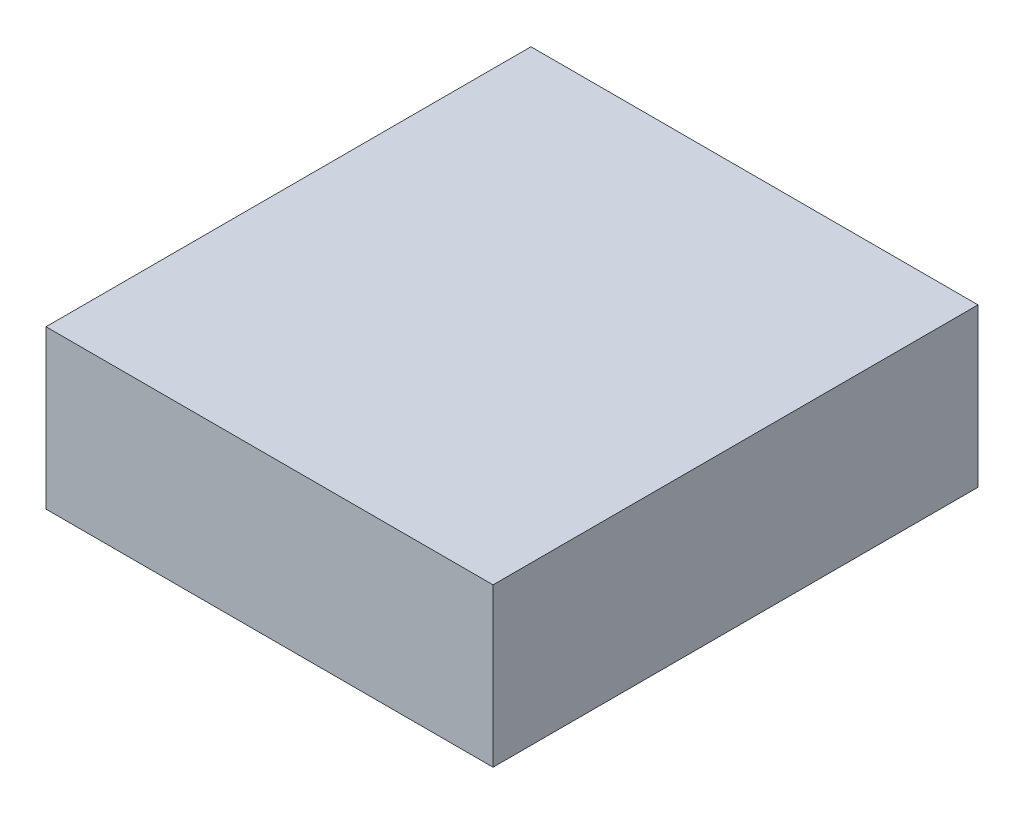
ISO-10303-21;
HEADER;
FILE_DESCRIPTION(('STEP AP214'),'2;1');
FILE_NAME('part.step','',(''),(''),'','','');
FILE_SCHEMA(('AUTOMOTIVE_DESIGN { 1 0 10303 214 1 1 1 1 }'));
ENDSEC;
DATA;
#1=APPLICATION_CONTEXT('core data for automotive mechanical design processes');
#2=APPLICATION_PROTOCOL_DEFINITION('international standard','automotive_design',2000,#1);
#3=PRODUCT_CONTEXT('',#1,'mechanical');
#4=PRODUCT('Part','Part','',(#3));
#5=PRODUCT_RELATED_PRODUCT_CATEGORY('part','',(#4));
#6=PRODUCT_DEFINITION_FORMATION('','',#4);
#7=PRODUCT_DEFINITION_CONTEXT('part definition',#1,'design');
#8=PRODUCT_DEFINITION('design','',#6,#7);
#9=PRODUCT_DEFINITION_SHAPE('','',#8);
#10=(LENGTH_UNIT() NAMED_UNIT(*) SI_UNIT(.MILLI.,.METRE.));
#11=(NAMED_UNIT(*) PLANE_ANGLE_UNIT() SI_UNIT($,.RADIAN.));
#12=(NAMED_UNIT(*) SI_UNIT($,.STERADIAN.) SOLID_ANGLE_UNIT());
#13=UNCERTAINTY_MEASURE_WITH_UNIT(LENGTH_MEASURE(1.E-05),#10,'distance_accuracy_value','');
#14=(GEOMETRIC_REPRESENTATION_CONTEXT(3) GLOBAL_UNCERTAINTY_ASSIGNED_CONTEXT((#13)) GLOBAL_UNIT_ASSIGNED_CONTEXT((#10,
#11,#12)) REPRESENTATION_CONTEXT('',''));
#15=CARTESIAN_POINT('',(0.,0.,0.));
#16=DIRECTION('',(0.,0.,1.));
#17=DIRECTION('',(1.,0.,0.));
#18=AXIS2_PLACEMENT_3D('',#15,#16,#17);
#19=CARTESIAN_POINT('',(42.4469053593128,30.,46.0462043517692));
#20=DIRECTION('',(-1.,0.,0.));
#21=DIRECTION('',(0.,0.,1.));
#22=AXIS2_PLACEMENT_3D('',#19,#20,#21);
#23=PLANE('',#22);
#24=DIRECTION('',(0.,0.,-1.));
#25=VECTOR('',#24,1.);
#26=CARTESIAN_POINT('',(42.4469053593128,0.,46.0462043517692));
#27=LINE('',#26,#25);
#28=CARTESIAN_POINT('',(42.4469053593128,0.,46.0462043517692));
#29=VERTEX_POINT('',#28);
#30=CARTESIAN_POINT('',(42.4469053593128,0.,-46.0462043517692));
#31=VERTEX_POINT('',#30);
#32=EDGE_CURVE('E98',#29,#31,#27,.T.);
#33=ORIENTED_EDGE('',*,*,#32,.T.);
#34=DIRECTION('',(0.,-1.,0.));
#35=VECTOR('',#34,1.);
#36=CARTESIAN_POINT('',(42.4469053593128,30.,-46.0462043517692));
#37=LINE('',#36,#35);
#38=CARTESIAN_POINT('',(42.4469053593128,30.,-46.0462043517692));
#39=VERTEX_POINT('',#38);
#40=EDGE_CURVE('E11',#39,#31,#37,.T.);
#41=ORIENTED_EDGE('',*,*,#40,.F.);
#42=DIRECTION('',(0.,0.,-1.));
#43=VECTOR('',#42,1.);
#44=CARTESIAN_POINT('',(42.4469053593128,30.,46.0462043517692));
#45=LINE('',#44,#43);
#46=CARTESIAN_POINT('',(42.4469053593128,30.,46.0462043517692));
#47=VERTEX_POINT('',#46);
#48=EDGE_CURVE('E86',#47,#39,#45,.T.);
#49=ORIENTED_EDGE('',*,*,#48,.F.);
#50=DIRECTION('',(0.,-1.,0.));
#51=VECTOR('',#50,1.);
#52=CARTESIAN_POINT('',(42.4469053593128,30.,46.0462043517692));
#53=LINE('',#52,#51);
#54=EDGE_CURVE('E94',#47,#29,#53,.T.);
#55=ORIENTED_EDGE('',*,*,#54,.T.);
#56=EDGE_LOOP('',(#33,#41,#49,#55));
#57=FACE_BOUND('',#56,.T.);
#58=ADVANCED_FACE('F35',(#57),#23,.F.);
#59=CARTESIAN_POINT('',(-42.4469053593128,30.,-46.0462043517692));
#60=DIRECTION('',(0.,0.,1.));
#61=DIRECTION('',(1.,0.,0.));
#62=AXIS2_PLACEMENT_3D('',#59,#60,#61);
#63=PLANE('',#62);
#64=DIRECTION('',(-1.,0.,0.));
#65=VECTOR('',#64,1.);
#66=CARTESIAN_POINT('',(-42.4469053593128,0.,-46.0462043517692));
#67=LINE('',#66,#65);
#68=CARTESIAN_POINT('',(-42.4469053593128,0.,-46.0462043517692));
#69=VERTEX_POINT('',#68);
#70=EDGE_CURVE('E90',#31,#69,#67,.T.);
#71=ORIENTED_EDGE('',*,*,#70,.T.);
#72=DIRECTION('',(0.,-1.,0.));
#73=VECTOR('',#72,1.);
#74=CARTESIAN_POINT('',(-42.4469053593128,30.,-46.0462043517692));
#75=LINE('',#74,#73);
#76=CARTESIAN_POINT('',(-42.4469053593128,30.,-46.0462043517692));
#77=VERTEX_POINT('',#76);
#78=EDGE_CURVE('E43',#77,#69,#75,.T.);
#79=ORIENTED_EDGE('',*,*,#78,.F.);
#80=DIRECTION('',(-1.,0.,0.));
#81=VECTOR('',#80,1.);
#82=CARTESIAN_POINT('',(-42.4469053593128,30.,-46.0462043517692));
#83=LINE('',#82,#81);
#84=EDGE_CURVE('E81',#39,#77,#83,.T.);
#85=ORIENTED_EDGE('',*,*,#84,.F.);
#86=ORIENTED_EDGE('',*,*,#40,.T.);
#87=EDGE_LOOP('',(#71,#79,#85,#86));
#88=FACE_BOUND('',#87,.T.);
#89=ADVANCED_FACE('F89',(#88),#63,.F.);
#90=CARTESIAN_POINT('',(-42.4469053593128,30.,46.0462043517692));
#91=DIRECTION('',(1.,0.,0.));
#92=DIRECTION('',(0.,0.,-1.));
#93=AXIS2_PLACEMENT_3D('',#90,#91,#92);
#94=PLANE('',#93);
#95=DIRECTION('',(0.,0.,1.));
#96=VECTOR('',#95,1.);
#97=CARTESIAN_POINT('',(-42.4469053593128,0.,46.0462043517692));
#98=LINE('',#97,#96);
#99=CARTESIAN_POINT('',(-42.4469053593128,0.,46.0462043517692));
#100=VERTEX_POINT('',#99);
#101=EDGE_CURVE('E68',#69,#100,#98,.T.);
#102=ORIENTED_EDGE('',*,*,#101,.T.);
#103=DIRECTION('',(0.,-1.,0.));
#104=VECTOR('',#103,1.);
#105=CARTESIAN_POINT('',(-42.4469053593128,30.,46.0462043517692));
#106=LINE('',#105,#104);
#107=CARTESIAN_POINT('',(-42.4469053593128,30.,46.0462043517692));
#108=VERTEX_POINT('',#107);
#109=EDGE_CURVE('E91',#108,#100,#106,.T.);
#110=ORIENTED_EDGE('',*,*,#109,.F.);
#111=DIRECTION('',(0.,0.,1.));
#112=VECTOR('',#111,1.);
#113=CARTESIAN_POINT('',(-42.4469053593128,30.,46.0462043517692));
#114=LINE('',#113,#112);
#115=EDGE_CURVE('E84',#77,#108,#114,.T.);
#116=ORIENTED_EDGE('',*,*,#115,.F.);
#117=ORIENTED_EDGE('',*,*,#78,.T.);
#118=EDGE_LOOP('',(#102,#110,#116,#117));
#119=FACE_BOUND('',#118,.T.);
#120=ADVANCED_FACE('F92',(#119),#94,.F.);
#121=CARTESIAN_POINT('',(-42.4469053593128,30.,46.0462043517692));
#122=DIRECTION('',(0.,0.,-1.));
#123=DIRECTION('',(-1.,0.,0.));
#124=AXIS2_PLACEMENT_3D('',#121,#122,#123);
#125=PLANE('',#124);
#126=DIRECTION('',(1.,0.,0.));
#127=VECTOR('',#126,1.);
#128=CARTESIAN_POINT('',(-42.4469053593128,0.,46.0462043517692));
#129=LINE('',#128,#127);
#130=EDGE_CURVE('E74',#100,#29,#129,.T.);
#131=ORIENTED_EDGE('',*,*,#130,.T.);
#132=ORIENTED_EDGE('',*,*,#54,.F.);
#133=DIRECTION('',(1.,0.,0.));
#134=VECTOR('',#133,1.);
#135=CARTESIAN_POINT('',(-42.4469053593128,30.,46.0462043517692));
#136=LINE('',#135,#134);
#137=EDGE_CURVE('E51',#108,#47,#136,.T.);
#138=ORIENTED_EDGE('',*,*,#137,.F.);
#139=ORIENTED_EDGE('',*,*,#109,.T.);
#140=EDGE_LOOP('',(#131,#132,#138,#139));
#141=FACE_BOUND('',#140,.T.);
#142=ADVANCED_FACE('F105',(#141),#125,.F.);
#143=CARTESIAN_POINT('',(0.,30.,0.));
#144=DIRECTION('',(0.,-1.,0.));
#145=DIRECTION('',(0.,0.,-1.));
#146=AXIS2_PLACEMENT_3D('',#143,#144,#145);
#147=PLANE('',#146);
#148=ORIENTED_EDGE('',*,*,#48,.T.);
#149=ORIENTED_EDGE('',*,*,#84,.T.);
#150=ORIENTED_EDGE('',*,*,#115,.T.);
#151=ORIENTED_EDGE('',*,*,#137,.T.);
#152=EDGE_LOOP('',(#148,#149,#150,#151));
#153=FACE_BOUND('',#152,.T.);
#154=ADVANCED_FACE('F82',(#153),#147,.F.);
#155=CARTESIAN_POINT('',(0.,0.,0.));
#156=DIRECTION('',(0.,-1.,0.));
#157=DIRECTION('',(0.,0.,-1.));
#158=AXIS2_PLACEMENT_3D('',#155,#156,#157);
#159=PLANE('',#158);
#160=ORIENTED_EDGE('',*,*,#32,.F.);
#161=ORIENTED_EDGE('',*,*,#130,.F.);
#162=ORIENTED_EDGE('',*,*,#101,.F.);
#163=ORIENTED_EDGE('',*,*,#70,.F.);
#164=EDGE_LOOP('',(#160,#161,#162,#163));
#165=FACE_BOUND('',#164,.T.);
#166=ADVANCED_FACE('F108',(#165),#159,.T.);
#167=CLOSED_SHELL('',(#58,#89,#120,#142,#154,#166));
#168=MANIFOLD_SOLID_BREP('B2',#167);
#169=ADVANCED_BREP_SHAPE_REPRESENTATION('',(#18,#168),#14);
#170=SHAPE_DEFINITION_REPRESENTATION(#9,#169);
ENDSEC;
END-ISO-10303-21;
